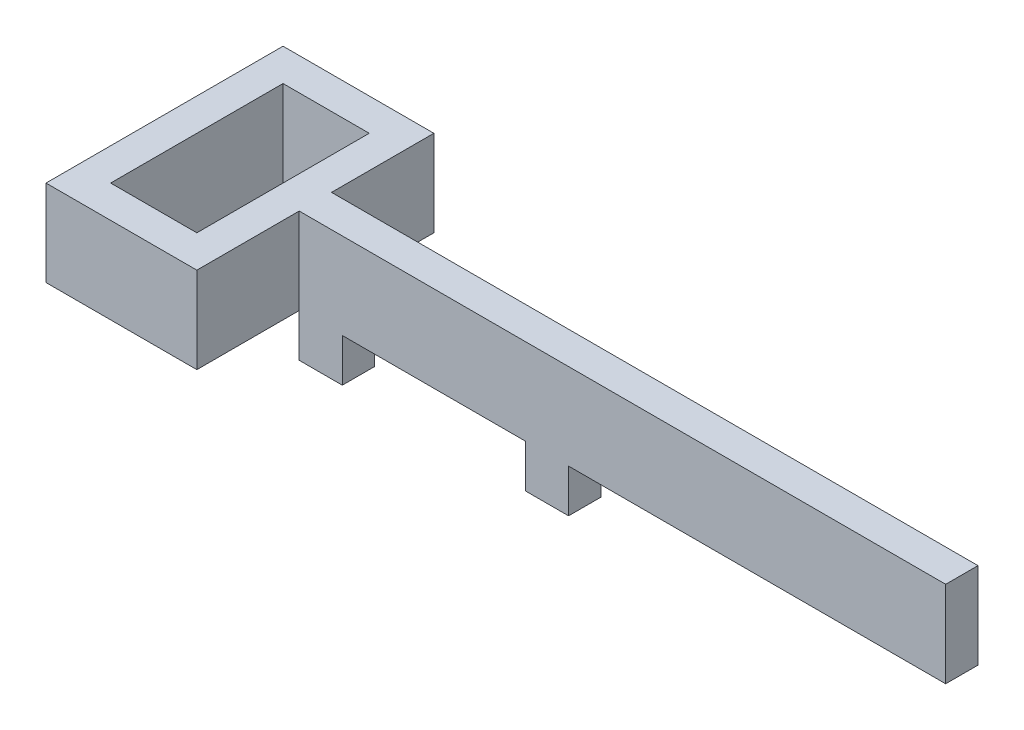
ISO-10303-21;
HEADER;
FILE_DESCRIPTION(('STEP AP214'),'2;1');
FILE_NAME('part.step','',(''),(''),'','','');
FILE_SCHEMA(('AUTOMOTIVE_DESIGN { 1 0 10303 214 1 1 1 1 }'));
ENDSEC;
DATA;
#1=APPLICATION_CONTEXT('core data for automotive mechanical design processes');
#2=APPLICATION_PROTOCOL_DEFINITION('international standard','automotive_design',2000,#1);
#3=PRODUCT_CONTEXT('',#1,'mechanical');
#4=PRODUCT('Part','Part','',(#3));
#5=PRODUCT_RELATED_PRODUCT_CATEGORY('part','',(#4));
#6=PRODUCT_DEFINITION_FORMATION('','',#4);
#7=PRODUCT_DEFINITION_CONTEXT('part definition',#1,'design');
#8=PRODUCT_DEFINITION('design','',#6,#7);
#9=PRODUCT_DEFINITION_SHAPE('','',#8);
#10=(LENGTH_UNIT() NAMED_UNIT(*) SI_UNIT(.MILLI.,.METRE.));
#11=(NAMED_UNIT(*) PLANE_ANGLE_UNIT() SI_UNIT($,.RADIAN.));
#12=(NAMED_UNIT(*) SI_UNIT($,.STERADIAN.) SOLID_ANGLE_UNIT());
#13=UNCERTAINTY_MEASURE_WITH_UNIT(LENGTH_MEASURE(1.E-05),#10,'distance_accuracy_value','');
#14=(GEOMETRIC_REPRESENTATION_CONTEXT(3) GLOBAL_UNCERTAINTY_ASSIGNED_CONTEXT((#13)) GLOBAL_UNIT_ASSIGNED_CONTEXT((#10,
#11,#12)) REPRESENTATION_CONTEXT('',''));
#15=CARTESIAN_POINT('',(0.,0.,0.));
#16=DIRECTION('',(0.,0.,1.));
#17=DIRECTION('',(1.,0.,0.));
#18=AXIS2_PLACEMENT_3D('',#15,#16,#17);
#19=CARTESIAN_POINT('',(0.,0.,0.));
#20=DIRECTION('',(0.,1.,0.));
#21=DIRECTION('',(0.,0.,1.));
#22=AXIS2_PLACEMENT_3D('',#19,#20,#21);
#23=PLANE('',#22);
#24=DIRECTION('',(0.,0.,-1.));
#25=VECTOR('',#24,1.);
#26=CARTESIAN_POINT('',(2.,0.,0.));
#27=LINE('',#26,#25);
#28=CARTESIAN_POINT('',(2.,0.,4.));
#29=VERTEX_POINT('',#28);
#30=CARTESIAN_POINT('',(2.,0.,-4.));
#31=VERTEX_POINT('',#30);
#32=EDGE_CURVE('E317',#29,#31,#27,.T.);
#33=ORIENTED_EDGE('',*,*,#32,.T.);
#34=DIRECTION('',(1.,0.,0.));
#35=VECTOR('',#34,1.);
#36=CARTESIAN_POINT('',(0.,0.,-4.));
#37=LINE('',#36,#35);
#38=CARTESIAN_POINT('',(-2.,0.,-4.));
#39=VERTEX_POINT('',#38);
#40=EDGE_CURVE('E253',#39,#31,#37,.T.);
#41=ORIENTED_EDGE('',*,*,#40,.F.);
#42=DIRECTION('',(0.,0.,-1.));
#43=VECTOR('',#42,1.);
#44=CARTESIAN_POINT('',(-2.,0.,0.));
#45=LINE('',#44,#43);
#46=CARTESIAN_POINT('',(-2.,0.,4.));
#47=VERTEX_POINT('',#46);
#48=EDGE_CURVE('E326',#47,#39,#45,.T.);
#49=ORIENTED_EDGE('',*,*,#48,.F.);
#50=DIRECTION('',(1.,0.,0.));
#51=VECTOR('',#50,1.);
#52=CARTESIAN_POINT('',(0.,0.,4.));
#53=LINE('',#52,#51);
#54=EDGE_CURVE('E322',#47,#29,#53,.T.);
#55=ORIENTED_EDGE('',*,*,#54,.T.);
#56=EDGE_LOOP('',(#33,#41,#49,#55));
#57=FACE_BOUND('',#56,.T.);
#58=DIRECTION('',(0.,0.,-1.));
#59=VECTOR('',#58,1.);
#60=CARTESIAN_POINT('',(3.5,0.,0.75));
#61=LINE('',#60,#59);
#62=CARTESIAN_POINT('',(3.5,0.,0.75));
#63=VERTEX_POINT('',#62);
#64=CARTESIAN_POINT('',(3.5,0.,-0.75));
#65=VERTEX_POINT('',#64);
#66=EDGE_CURVE('E204',#63,#65,#61,.T.);
#67=ORIENTED_EDGE('',*,*,#66,.F.);
#68=DIRECTION('',(0.,0.,-1.));
#69=VECTOR('',#68,1.);
#70=CARTESIAN_POINT('',(3.5,0.,0.));
#71=LINE('',#70,#69);
#72=CARTESIAN_POINT('',(3.5,0.,5.5));
#73=VERTEX_POINT('',#72);
#74=EDGE_CURVE('E303',#73,#63,#71,.T.);
#75=ORIENTED_EDGE('',*,*,#74,.F.);
#76=DIRECTION('',(1.,0.,0.));
#77=VECTOR('',#76,1.);
#78=CARTESIAN_POINT('',(0.,0.,5.5));
#79=LINE('',#78,#77);
#80=CARTESIAN_POINT('',(-3.5,0.,5.5));
#81=VERTEX_POINT('',#80);
#82=EDGE_CURVE('E311',#81,#73,#79,.T.);
#83=ORIENTED_EDGE('',*,*,#82,.F.);
#84=DIRECTION('',(0.,0.,-1.));
#85=VECTOR('',#84,1.);
#86=CARTESIAN_POINT('',(-3.5,0.,0.));
#87=LINE('',#86,#85);
#88=CARTESIAN_POINT('',(-3.5,0.,-5.5));
#89=VERTEX_POINT('',#88);
#90=EDGE_CURVE('E307',#81,#89,#87,.T.);
#91=ORIENTED_EDGE('',*,*,#90,.T.);
#92=DIRECTION('',(1.,0.,0.));
#93=VECTOR('',#92,1.);
#94=CARTESIAN_POINT('',(0.,0.,-5.5));
#95=LINE('',#94,#93);
#96=CARTESIAN_POINT('',(3.5,0.,-5.5));
#97=VERTEX_POINT('',#96);
#98=EDGE_CURVE('E302',#89,#97,#95,.T.);
#99=ORIENTED_EDGE('',*,*,#98,.T.);
#100=EDGE_CURVE('E298',#65,#97,#71,.T.);
#101=ORIENTED_EDGE('',*,*,#100,.F.);
#102=EDGE_LOOP('',(#67,#75,#83,#91,#99,#101));
#103=FACE_BOUND('',#102,.T.);
#104=ADVANCED_FACE('F47',(#57,#103),#23,.F.);
#105=DIRECTION('',(0.,0.,1.));
#106=VECTOR('',#105,1.);
#107=CARTESIAN_POINT('',(5.5,0.,0.75));
#108=LINE('',#107,#106);
#109=CARTESIAN_POINT('',(5.5,0.,-0.75));
#110=VERTEX_POINT('',#109);
#111=CARTESIAN_POINT('',(5.5,0.,0.749999999999999));
#112=VERTEX_POINT('',#111);
#113=EDGE_CURVE('E200',#110,#112,#108,.T.);
#114=ORIENTED_EDGE('',*,*,#113,.F.);
#115=DIRECTION('',(1.,0.,0.));
#116=VECTOR('',#115,1.);
#117=CARTESIAN_POINT('',(0.,0.,-0.75));
#118=LINE('',#117,#116);
#119=CARTESIAN_POINT('',(14.,0.,-0.75));
#120=VERTEX_POINT('',#119);
#121=EDGE_CURVE('E295',#110,#120,#118,.T.);
#122=ORIENTED_EDGE('',*,*,#121,.T.);
#123=DIRECTION('',(0.,0.,-1.));
#124=VECTOR('',#123,1.);
#125=CARTESIAN_POINT('',(14.,0.,0.75));
#126=LINE('',#125,#124);
#127=CARTESIAN_POINT('',(14.,0.,0.749999999999994));
#128=VERTEX_POINT('',#127);
#129=EDGE_CURVE('E207',#128,#120,#126,.T.);
#130=ORIENTED_EDGE('',*,*,#129,.F.);
#131=DIRECTION('',(1.,0.,0.));
#132=VECTOR('',#131,1.);
#133=CARTESIAN_POINT('',(0.,0.,0.750000000000002));
#134=LINE('',#133,#132);
#135=EDGE_CURVE('E314',#112,#128,#134,.T.);
#136=ORIENTED_EDGE('',*,*,#135,.F.);
#137=EDGE_LOOP('',(#114,#122,#130,#136));
#138=FACE_BOUND('',#137,.T.);
#139=ADVANCED_FACE('F424',(#138),#23,.F.);
#140=DIRECTION('',(0.,0.,1.));
#141=VECTOR('',#140,1.);
#142=CARTESIAN_POINT('',(16.,0.,0.75));
#143=LINE('',#142,#141);
#144=CARTESIAN_POINT('',(16.,0.,-0.75));
#145=VERTEX_POINT('',#144);
#146=CARTESIAN_POINT('',(16.,0.,0.75));
#147=VERTEX_POINT('',#146);
#148=EDGE_CURVE('E73',#145,#147,#143,.T.);
#149=ORIENTED_EDGE('',*,*,#148,.F.);
#150=CARTESIAN_POINT('',(33.5,0.,-0.75));
#151=VERTEX_POINT('',#150);
#152=EDGE_CURVE('E294',#145,#151,#118,.T.);
#153=ORIENTED_EDGE('',*,*,#152,.T.);
#154=DIRECTION('',(0.,0.,1.));
#155=VECTOR('',#154,1.);
#156=CARTESIAN_POINT('',(33.5,0.,0.));
#157=LINE('',#156,#155);
#158=CARTESIAN_POINT('',(33.5,0.,0.749999999999982));
#159=VERTEX_POINT('',#158);
#160=EDGE_CURVE('E247',#151,#159,#157,.T.);
#161=ORIENTED_EDGE('',*,*,#160,.T.);
#162=EDGE_CURVE('E318',#147,#159,#134,.T.);
#163=ORIENTED_EDGE('',*,*,#162,.F.);
#164=EDGE_LOOP('',(#149,#153,#161,#163));
#165=FACE_BOUND('',#164,.T.);
#166=ADVANCED_FACE('F374',(#165),#23,.F.);
#167=CARTESIAN_POINT('',(2.,4.,0.));
#168=DIRECTION('',(-1.,0.,0.));
#169=DIRECTION('',(0.,0.,1.));
#170=AXIS2_PLACEMENT_3D('',#167,#168,#169);
#171=PLANE('',#170);
#172=ORIENTED_EDGE('',*,*,#32,.F.);
#173=DIRECTION('',(0.,-1.,0.));
#174=VECTOR('',#173,1.);
#175=CARTESIAN_POINT('',(2.,4.,4.));
#176=LINE('',#175,#174);
#177=CARTESIAN_POINT('',(2.,4.,4.));
#178=VERTEX_POINT('',#177);
#179=EDGE_CURVE('E11',#178,#29,#176,.T.);
#180=ORIENTED_EDGE('',*,*,#179,.F.);
#181=DIRECTION('',(0.,0.,-1.));
#182=VECTOR('',#181,1.);
#183=CARTESIAN_POINT('',(2.,4.,0.));
#184=LINE('',#183,#182);
#185=CARTESIAN_POINT('',(2.,4.,-4.));
#186=VERTEX_POINT('',#185);
#187=EDGE_CURVE('E275',#178,#186,#184,.T.);
#188=ORIENTED_EDGE('',*,*,#187,.T.);
#189=DIRECTION('',(0.,-1.,0.));
#190=VECTOR('',#189,1.);
#191=CARTESIAN_POINT('',(2.,4.,-4.));
#192=LINE('',#191,#190);
#193=EDGE_CURVE('E333',#186,#31,#192,.T.);
#194=ORIENTED_EDGE('',*,*,#193,.T.);
#195=EDGE_LOOP('',(#172,#180,#188,#194));
#196=FACE_BOUND('',#195,.T.);
#197=ADVANCED_FACE('F454',(#196),#171,.T.);
#198=CARTESIAN_POINT('',(0.,4.,4.));
#199=DIRECTION('',(0.,0.,-1.));
#200=DIRECTION('',(-1.,0.,0.));
#201=AXIS2_PLACEMENT_3D('',#198,#199,#200);
#202=PLANE('',#201);
#203=ORIENTED_EDGE('',*,*,#54,.F.);
#204=DIRECTION('',(0.,-1.,0.));
#205=VECTOR('',#204,1.);
#206=CARTESIAN_POINT('',(-2.,4.,4.));
#207=LINE('',#206,#205);
#208=CARTESIAN_POINT('',(-2.,4.,4.));
#209=VERTEX_POINT('',#208);
#210=EDGE_CURVE('E57',#209,#47,#207,.T.);
#211=ORIENTED_EDGE('',*,*,#210,.F.);
#212=DIRECTION('',(1.,0.,0.));
#213=VECTOR('',#212,1.);
#214=CARTESIAN_POINT('',(0.,4.,4.));
#215=LINE('',#214,#213);
#216=EDGE_CURVE('E279',#209,#178,#215,.T.);
#217=ORIENTED_EDGE('',*,*,#216,.T.);
#218=ORIENTED_EDGE('',*,*,#179,.T.);
#219=EDGE_LOOP('',(#203,#211,#217,#218));
#220=FACE_BOUND('',#219,.T.);
#221=ADVANCED_FACE('F459',(#220),#202,.T.);
#222=CARTESIAN_POINT('',(-2.,4.,0.));
#223=DIRECTION('',(-1.,0.,0.));
#224=DIRECTION('',(0.,0.,1.));
#225=AXIS2_PLACEMENT_3D('',#222,#223,#224);
#226=PLANE('',#225);
#227=ORIENTED_EDGE('',*,*,#48,.T.);
#228=DIRECTION('',(0.,-1.,0.));
#229=VECTOR('',#228,1.);
#230=CARTESIAN_POINT('',(-2.,4.,-4.));
#231=LINE('',#230,#229);
#232=CARTESIAN_POINT('',(-2.,4.,-4.));
#233=VERTEX_POINT('',#232);
#234=EDGE_CURVE('E336',#233,#39,#231,.T.);
#235=ORIENTED_EDGE('',*,*,#234,.F.);
#236=DIRECTION('',(0.,0.,-1.));
#237=VECTOR('',#236,1.);
#238=CARTESIAN_POINT('',(-2.,4.,0.));
#239=LINE('',#238,#237);
#240=EDGE_CURVE('E283',#209,#233,#239,.T.);
#241=ORIENTED_EDGE('',*,*,#240,.F.);
#242=ORIENTED_EDGE('',*,*,#210,.T.);
#243=EDGE_LOOP('',(#227,#235,#241,#242));
#244=FACE_BOUND('',#243,.T.);
#245=ADVANCED_FACE('F465',(#244),#226,.F.);
#246=CARTESIAN_POINT('',(33.5,4.,0.));
#247=DIRECTION('',(1.,0.,0.));
#248=DIRECTION('',(0.,0.,-1.));
#249=AXIS2_PLACEMENT_3D('',#246,#247,#248);
#250=PLANE('',#249);
#251=ORIENTED_EDGE('',*,*,#160,.F.);
#252=DIRECTION('',(0.,-1.,0.));
#253=VECTOR('',#252,1.);
#254=CARTESIAN_POINT('',(33.5,4.,-0.75));
#255=LINE('',#254,#253);
#256=CARTESIAN_POINT('',(33.5,4.,-0.75));
#257=VERTEX_POINT('',#256);
#258=EDGE_CURVE('E51',#257,#151,#255,.T.);
#259=ORIENTED_EDGE('',*,*,#258,.F.);
#260=DIRECTION('',(0.,0.,1.));
#261=VECTOR('',#260,1.);
#262=CARTESIAN_POINT('',(33.5,4.,0.));
#263=LINE('',#262,#261);
#264=CARTESIAN_POINT('',(33.5,4.,0.749999999999982));
#265=VERTEX_POINT('',#264);
#266=EDGE_CURVE('E248',#257,#265,#263,.T.);
#267=ORIENTED_EDGE('',*,*,#266,.T.);
#268=DIRECTION('',(0.,-1.,0.));
#269=VECTOR('',#268,1.);
#270=CARTESIAN_POINT('',(33.5,4.,0.749999999999982));
#271=LINE('',#270,#269);
#272=EDGE_CURVE('E290',#265,#159,#271,.T.);
#273=ORIENTED_EDGE('',*,*,#272,.T.);
#274=EDGE_LOOP('',(#251,#259,#267,#273));
#275=FACE_BOUND('',#274,.T.);
#276=ADVANCED_FACE('F49',(#275),#250,.T.);
#277=CARTESIAN_POINT('',(0.,4.,-0.75));
#278=DIRECTION('',(0.,0.,-1.));
#279=DIRECTION('',(-1.,0.,0.));
#280=AXIS2_PLACEMENT_3D('',#277,#278,#279);
#281=PLANE('',#280);
#282=ORIENTED_EDGE('',*,*,#121,.F.);
#283=DIRECTION('',(0.,1.,0.));
#284=VECTOR('',#283,1.);
#285=CARTESIAN_POINT('',(5.5,-2.,-0.75));
#286=LINE('',#285,#284);
#287=CARTESIAN_POINT('',(5.5,-2.,-0.75));
#288=VERTEX_POINT('',#287);
#289=EDGE_CURVE('E187',#288,#110,#286,.T.);
#290=ORIENTED_EDGE('',*,*,#289,.F.);
#291=DIRECTION('',(1.,0.,0.));
#292=VECTOR('',#291,1.);
#293=CARTESIAN_POINT('',(3.5,-2.,-0.75));
#294=LINE('',#293,#292);
#295=CARTESIAN_POINT('',(3.5,-2.,-0.75));
#296=VERTEX_POINT('',#295);
#297=EDGE_CURVE('E180',#296,#288,#294,.T.);
#298=ORIENTED_EDGE('',*,*,#297,.F.);
#299=DIRECTION('',(0.,1.,0.));
#300=VECTOR('',#299,1.);
#301=CARTESIAN_POINT('',(3.5,-2.,-0.75));
#302=LINE('',#301,#300);
#303=EDGE_CURVE('E185',#296,#65,#302,.T.);
#304=ORIENTED_EDGE('',*,*,#303,.T.);
#305=DIRECTION('',(0.,-1.,0.));
#306=VECTOR('',#305,1.);
#307=CARTESIAN_POINT('',(3.5,4.,-0.75));
#308=LINE('',#307,#306);
#309=CARTESIAN_POINT('',(3.5,4.,-0.75));
#310=VERTEX_POINT('',#309);
#311=EDGE_CURVE('E361',#310,#65,#308,.T.);
#312=ORIENTED_EDGE('',*,*,#311,.F.);
#313=DIRECTION('',(1.,0.,0.));
#314=VECTOR('',#313,1.);
#315=CARTESIAN_POINT('',(0.,4.,-0.75));
#316=LINE('',#315,#314);
#317=EDGE_CURVE('E252',#310,#257,#316,.T.);
#318=ORIENTED_EDGE('',*,*,#317,.T.);
#319=ORIENTED_EDGE('',*,*,#258,.T.);
#320=ORIENTED_EDGE('',*,*,#152,.F.);
#321=DIRECTION('',(0.,1.,0.));
#322=VECTOR('',#321,1.);
#323=CARTESIAN_POINT('',(16.,-2.,-0.75));
#324=LINE('',#323,#322);
#325=CARTESIAN_POINT('',(16.,-2.,-0.75));
#326=VERTEX_POINT('',#325);
#327=EDGE_CURVE('E239',#326,#145,#324,.T.);
#328=ORIENTED_EDGE('',*,*,#327,.F.);
#329=DIRECTION('',(1.,0.,0.));
#330=VECTOR('',#329,1.);
#331=CARTESIAN_POINT('',(14.,-2.,-0.75));
#332=LINE('',#331,#330);
#333=CARTESIAN_POINT('',(14.,-2.,-0.75));
#334=VERTEX_POINT('',#333);
#335=EDGE_CURVE('E220',#334,#326,#332,.T.);
#336=ORIENTED_EDGE('',*,*,#335,.F.);
#337=DIRECTION('',(0.,1.,0.));
#338=VECTOR('',#337,1.);
#339=CARTESIAN_POINT('',(14.,-2.,-0.75));
#340=LINE('',#339,#338);
#341=EDGE_CURVE('E243',#334,#120,#340,.T.);
#342=ORIENTED_EDGE('',*,*,#341,.T.);
#343=EDGE_LOOP('',(#282,#290,#298,#304,#312,#318,#319,#320,#328,#336,#342));
#344=FACE_BOUND('',#343,.T.);
#345=ADVANCED_FACE('F183',(#344),#281,.T.);
#346=CARTESIAN_POINT('',(3.5,4.,0.));
#347=DIRECTION('',(-1.,0.,0.));
#348=DIRECTION('',(0.,0.,1.));
#349=AXIS2_PLACEMENT_3D('',#346,#347,#348);
#350=PLANE('',#349);
#351=ORIENTED_EDGE('',*,*,#100,.T.);
#352=DIRECTION('',(0.,-1.,0.));
#353=VECTOR('',#352,1.);
#354=CARTESIAN_POINT('',(3.5,4.,-5.5));
#355=LINE('',#354,#353);
#356=CARTESIAN_POINT('',(3.5,4.,-5.5));
#357=VERTEX_POINT('',#356);
#358=EDGE_CURVE('E359',#357,#97,#355,.T.);
#359=ORIENTED_EDGE('',*,*,#358,.F.);
#360=DIRECTION('',(0.,0.,-1.));
#361=VECTOR('',#360,1.);
#362=CARTESIAN_POINT('',(3.5,4.,0.));
#363=LINE('',#362,#361);
#364=EDGE_CURVE('E257',#310,#357,#363,.T.);
#365=ORIENTED_EDGE('',*,*,#364,.F.);
#366=ORIENTED_EDGE('',*,*,#311,.T.);
#367=EDGE_LOOP('',(#351,#359,#365,#366));
#368=FACE_BOUND('',#367,.T.);
#369=ADVANCED_FACE('F395',(#368),#350,.F.);
#370=CARTESIAN_POINT('',(0.,4.,-5.5));
#371=DIRECTION('',(0.,0.,-1.));
#372=DIRECTION('',(-1.,0.,0.));
#373=AXIS2_PLACEMENT_3D('',#370,#371,#372);
#374=PLANE('',#373);
#375=ORIENTED_EDGE('',*,*,#98,.F.);
#376=DIRECTION('',(0.,-1.,0.));
#377=VECTOR('',#376,1.);
#378=CARTESIAN_POINT('',(-3.5,4.,-5.5));
#379=LINE('',#378,#377);
#380=CARTESIAN_POINT('',(-3.5,4.,-5.5));
#381=VERTEX_POINT('',#380);
#382=EDGE_CURVE('E356',#381,#89,#379,.T.);
#383=ORIENTED_EDGE('',*,*,#382,.F.);
#384=DIRECTION('',(1.,0.,0.));
#385=VECTOR('',#384,1.);
#386=CARTESIAN_POINT('',(0.,4.,-5.5));
#387=LINE('',#386,#385);
#388=EDGE_CURVE('E260',#381,#357,#387,.T.);
#389=ORIENTED_EDGE('',*,*,#388,.T.);
#390=ORIENTED_EDGE('',*,*,#358,.T.);
#391=EDGE_LOOP('',(#375,#383,#389,#390));
#392=FACE_BOUND('',#391,.T.);
#393=ADVANCED_FACE('F398',(#392),#374,.T.);
#394=CARTESIAN_POINT('',(-3.5,4.,0.));
#395=DIRECTION('',(-1.,0.,0.));
#396=DIRECTION('',(0.,0.,1.));
#397=AXIS2_PLACEMENT_3D('',#394,#395,#396);
#398=PLANE('',#397);
#399=ORIENTED_EDGE('',*,*,#90,.F.);
#400=DIRECTION('',(0.,-1.,0.));
#401=VECTOR('',#400,1.);
#402=CARTESIAN_POINT('',(-3.5,4.,5.5));
#403=LINE('',#402,#401);
#404=CARTESIAN_POINT('',(-3.5,4.,5.5));
#405=VERTEX_POINT('',#404);
#406=EDGE_CURVE('E353',#405,#81,#403,.T.);
#407=ORIENTED_EDGE('',*,*,#406,.F.);
#408=DIRECTION('',(0.,0.,-1.));
#409=VECTOR('',#408,1.);
#410=CARTESIAN_POINT('',(-3.5,4.,0.));
#411=LINE('',#410,#409);
#412=EDGE_CURVE('E265',#405,#381,#411,.T.);
#413=ORIENTED_EDGE('',*,*,#412,.T.);
#414=ORIENTED_EDGE('',*,*,#382,.T.);
#415=EDGE_LOOP('',(#399,#407,#413,#414));
#416=FACE_BOUND('',#415,.T.);
#417=ADVANCED_FACE('F401',(#416),#398,.T.);
#418=CARTESIAN_POINT('',(0.,4.,5.5));
#419=DIRECTION('',(0.,0.,-1.));
#420=DIRECTION('',(-1.,0.,0.));
#421=AXIS2_PLACEMENT_3D('',#418,#419,#420);
#422=PLANE('',#421);
#423=ORIENTED_EDGE('',*,*,#82,.T.);
#424=DIRECTION('',(0.,-1.,0.));
#425=VECTOR('',#424,1.);
#426=CARTESIAN_POINT('',(3.5,4.,5.5));
#427=LINE('',#426,#425);
#428=CARTESIAN_POINT('',(3.5,4.,5.5));
#429=VERTEX_POINT('',#428);
#430=EDGE_CURVE('E349',#429,#73,#427,.T.);
#431=ORIENTED_EDGE('',*,*,#430,.F.);
#432=DIRECTION('',(1.,0.,0.));
#433=VECTOR('',#432,1.);
#434=CARTESIAN_POINT('',(0.,4.,5.5));
#435=LINE('',#434,#433);
#436=EDGE_CURVE('E269',#405,#429,#435,.T.);
#437=ORIENTED_EDGE('',*,*,#436,.F.);
#438=ORIENTED_EDGE('',*,*,#406,.T.);
#439=EDGE_LOOP('',(#423,#431,#437,#438));
#440=FACE_BOUND('',#439,.T.);
#441=ADVANCED_FACE('F404',(#440),#422,.F.);
#442=ORIENTED_EDGE('',*,*,#74,.T.);
#443=DIRECTION('',(0.,-1.,0.));
#444=VECTOR('',#443,1.);
#445=CARTESIAN_POINT('',(3.5,4.,0.75));
#446=LINE('',#445,#444);
#447=CARTESIAN_POINT('',(3.5,4.,0.75));
#448=VERTEX_POINT('',#447);
#449=EDGE_CURVE('E345',#448,#63,#446,.T.);
#450=ORIENTED_EDGE('',*,*,#449,.F.);
#451=EDGE_CURVE('E261',#429,#448,#363,.T.);
#452=ORIENTED_EDGE('',*,*,#451,.F.);
#453=ORIENTED_EDGE('',*,*,#430,.T.);
#454=EDGE_LOOP('',(#442,#450,#452,#453));
#455=FACE_BOUND('',#454,.T.);
#456=ADVANCED_FACE('F390',(#455),#350,.F.);
#457=CARTESIAN_POINT('',(0.,4.,0.750000000000002));
#458=DIRECTION('',(0.,0.,-1.));
#459=DIRECTION('',(-1.,0.,0.));
#460=AXIS2_PLACEMENT_3D('',#457,#458,#459);
#461=PLANE('',#460);
#462=ORIENTED_EDGE('',*,*,#449,.T.);
#463=DIRECTION('',(0.,1.,0.));
#464=VECTOR('',#463,1.);
#465=CARTESIAN_POINT('',(3.5,-2.,0.75));
#466=LINE('',#465,#464);
#467=CARTESIAN_POINT('',(3.5,-2.,0.75));
#468=VERTEX_POINT('',#467);
#469=EDGE_CURVE('E413',#468,#63,#466,.T.);
#470=ORIENTED_EDGE('',*,*,#469,.F.);
#471=DIRECTION('',(-1.,0.,0.));
#472=VECTOR('',#471,1.);
#473=CARTESIAN_POINT('',(3.5,-2.,0.75));
#474=LINE('',#473,#472);
#475=CARTESIAN_POINT('',(5.5,-2.,0.75));
#476=VERTEX_POINT('',#475);
#477=EDGE_CURVE('E196',#476,#468,#474,.T.);
#478=ORIENTED_EDGE('',*,*,#477,.F.);
#479=DIRECTION('',(0.,1.,0.));
#480=VECTOR('',#479,1.);
#481=CARTESIAN_POINT('',(5.5,-2.,0.75));
#482=LINE('',#481,#480);
#483=EDGE_CURVE('E65',#476,#112,#482,.T.);
#484=ORIENTED_EDGE('',*,*,#483,.T.);
#485=ORIENTED_EDGE('',*,*,#135,.T.);
#486=DIRECTION('',(0.,1.,0.));
#487=VECTOR('',#486,1.);
#488=CARTESIAN_POINT('',(14.,-2.,0.75));
#489=LINE('',#488,#487);
#490=CARTESIAN_POINT('',(14.,-2.,0.75));
#491=VERTEX_POINT('',#490);
#492=EDGE_CURVE('E228',#491,#128,#489,.T.);
#493=ORIENTED_EDGE('',*,*,#492,.F.);
#494=DIRECTION('',(-1.,0.,0.));
#495=VECTOR('',#494,1.);
#496=CARTESIAN_POINT('',(14.,-2.,0.75));
#497=LINE('',#496,#495);
#498=CARTESIAN_POINT('',(16.,-2.,0.75));
#499=VERTEX_POINT('',#498);
#500=EDGE_CURVE('E226',#499,#491,#497,.T.);
#501=ORIENTED_EDGE('',*,*,#500,.F.);
#502=DIRECTION('',(0.,1.,0.));
#503=VECTOR('',#502,1.);
#504=CARTESIAN_POINT('',(16.,-2.,0.75));
#505=LINE('',#504,#503);
#506=EDGE_CURVE('E235',#499,#147,#505,.T.);
#507=ORIENTED_EDGE('',*,*,#506,.T.);
#508=ORIENTED_EDGE('',*,*,#162,.T.);
#509=ORIENTED_EDGE('',*,*,#272,.F.);
#510=DIRECTION('',(1.,0.,0.));
#511=VECTOR('',#510,1.);
#512=CARTESIAN_POINT('',(0.,4.,0.750000000000002));
#513=LINE('',#512,#511);
#514=EDGE_CURVE('E272',#448,#265,#513,.T.);
#515=ORIENTED_EDGE('',*,*,#514,.F.);
#516=EDGE_LOOP('',(#462,#470,#478,#484,#485,#493,#501,#507,#508,#509,#515));
#517=FACE_BOUND('',#516,.T.);
#518=ADVANCED_FACE('F392',(#517),#461,.F.);
#519=CARTESIAN_POINT('',(0.,4.,-4.));
#520=DIRECTION('',(0.,0.,-1.));
#521=DIRECTION('',(-1.,0.,0.));
#522=AXIS2_PLACEMENT_3D('',#519,#520,#521);
#523=PLANE('',#522);
#524=ORIENTED_EDGE('',*,*,#40,.T.);
#525=ORIENTED_EDGE('',*,*,#193,.F.);
#526=DIRECTION('',(1.,0.,0.));
#527=VECTOR('',#526,1.);
#528=CARTESIAN_POINT('',(0.,4.,-4.));
#529=LINE('',#528,#527);
#530=EDGE_CURVE('E287',#233,#186,#529,.T.);
#531=ORIENTED_EDGE('',*,*,#530,.F.);
#532=ORIENTED_EDGE('',*,*,#234,.T.);
#533=EDGE_LOOP('',(#524,#525,#531,#532));
#534=FACE_BOUND('',#533,.T.);
#535=ADVANCED_FACE('F473',(#534),#523,.F.);
#536=CARTESIAN_POINT('',(0.,4.,0.));
#537=DIRECTION('',(0.,1.,0.));
#538=DIRECTION('',(0.,0.,1.));
#539=AXIS2_PLACEMENT_3D('',#536,#537,#538);
#540=PLANE('',#539);
#541=ORIENTED_EDGE('',*,*,#266,.F.);
#542=ORIENTED_EDGE('',*,*,#317,.F.);
#543=ORIENTED_EDGE('',*,*,#364,.T.);
#544=ORIENTED_EDGE('',*,*,#388,.F.);
#545=ORIENTED_EDGE('',*,*,#412,.F.);
#546=ORIENTED_EDGE('',*,*,#436,.T.);
#547=ORIENTED_EDGE('',*,*,#451,.T.);
#548=ORIENTED_EDGE('',*,*,#514,.T.);
#549=EDGE_LOOP('',(#541,#542,#543,#544,#545,#546,#547,#548));
#550=FACE_BOUND('',#549,.T.);
#551=ORIENTED_EDGE('',*,*,#187,.F.);
#552=ORIENTED_EDGE('',*,*,#216,.F.);
#553=ORIENTED_EDGE('',*,*,#240,.T.);
#554=ORIENTED_EDGE('',*,*,#530,.T.);
#555=EDGE_LOOP('',(#551,#552,#553,#554));
#556=FACE_BOUND('',#555,.T.);
#557=ADVANCED_FACE('F383',(#550,#556),#540,.T.);
#558=CARTESIAN_POINT('',(14.,-2.,0.75));
#559=DIRECTION('',(1.,0.,0.));
#560=DIRECTION('',(0.,0.,-1.));
#561=AXIS2_PLACEMENT_3D('',#558,#559,#560);
#562=PLANE('',#561);
#563=ORIENTED_EDGE('',*,*,#129,.T.);
#564=ORIENTED_EDGE('',*,*,#341,.F.);
#565=DIRECTION('',(0.,0.,-1.));
#566=VECTOR('',#565,1.);
#567=CARTESIAN_POINT('',(14.,-2.,0.75));
#568=LINE('',#567,#566);
#569=EDGE_CURVE('E216',#491,#334,#568,.T.);
#570=ORIENTED_EDGE('',*,*,#569,.F.);
#571=ORIENTED_EDGE('',*,*,#492,.T.);
#572=EDGE_LOOP('',(#563,#564,#570,#571));
#573=FACE_BOUND('',#572,.T.);
#574=ADVANCED_FACE('F430',(#573),#562,.F.);
#575=CARTESIAN_POINT('',(16.,-2.,0.75));
#576=DIRECTION('',(-1.,0.,0.));
#577=DIRECTION('',(0.,0.,1.));
#578=AXIS2_PLACEMENT_3D('',#575,#576,#577);
#579=PLANE('',#578);
#580=ORIENTED_EDGE('',*,*,#148,.T.);
#581=ORIENTED_EDGE('',*,*,#506,.F.);
#582=DIRECTION('',(0.,0.,1.));
#583=VECTOR('',#582,1.);
#584=CARTESIAN_POINT('',(16.,-2.,0.75));
#585=LINE('',#584,#583);
#586=EDGE_CURVE('E223',#326,#499,#585,.T.);
#587=ORIENTED_EDGE('',*,*,#586,.F.);
#588=ORIENTED_EDGE('',*,*,#327,.T.);
#589=EDGE_LOOP('',(#580,#581,#587,#588));
#590=FACE_BOUND('',#589,.T.);
#591=ADVANCED_FACE('F436',(#590),#579,.F.);
#592=CARTESIAN_POINT('',(0.,-2.,0.));
#593=DIRECTION('',(0.,-1.,0.));
#594=DIRECTION('',(0.,0.,-1.));
#595=AXIS2_PLACEMENT_3D('',#592,#593,#594);
#596=PLANE('',#595);
#597=ORIENTED_EDGE('',*,*,#569,.T.);
#598=ORIENTED_EDGE('',*,*,#335,.T.);
#599=ORIENTED_EDGE('',*,*,#586,.T.);
#600=ORIENTED_EDGE('',*,*,#500,.T.);
#601=EDGE_LOOP('',(#597,#598,#599,#600));
#602=FACE_BOUND('',#601,.T.);
#603=ADVANCED_FACE('F432',(#602),#596,.T.);
#604=CARTESIAN_POINT('',(3.5,-2.,0.75));
#605=DIRECTION('',(1.,0.,0.));
#606=DIRECTION('',(0.,0.,-1.));
#607=AXIS2_PLACEMENT_3D('',#604,#605,#606);
#608=PLANE('',#607);
#609=ORIENTED_EDGE('',*,*,#66,.T.);
#610=ORIENTED_EDGE('',*,*,#303,.F.);
#611=DIRECTION('',(0.,0.,-1.));
#612=VECTOR('',#611,1.);
#613=CARTESIAN_POINT('',(3.5,-2.,0.75));
#614=LINE('',#613,#612);
#615=EDGE_CURVE('E192',#468,#296,#614,.T.);
#616=ORIENTED_EDGE('',*,*,#615,.F.);
#617=ORIENTED_EDGE('',*,*,#469,.T.);
#618=EDGE_LOOP('',(#609,#610,#616,#617));
#619=FACE_BOUND('',#618,.T.);
#620=ADVANCED_FACE('F202',(#619),#608,.F.);
#621=CARTESIAN_POINT('',(5.5,-2.,0.75));
#622=DIRECTION('',(-1.,0.,0.));
#623=DIRECTION('',(0.,0.,1.));
#624=AXIS2_PLACEMENT_3D('',#621,#622,#623);
#625=PLANE('',#624);
#626=ORIENTED_EDGE('',*,*,#113,.T.);
#627=ORIENTED_EDGE('',*,*,#483,.F.);
#628=DIRECTION('',(0.,0.,1.));
#629=VECTOR('',#628,1.);
#630=CARTESIAN_POINT('',(5.5,-2.,0.75));
#631=LINE('',#630,#629);
#632=EDGE_CURVE('E191',#288,#476,#631,.T.);
#633=ORIENTED_EDGE('',*,*,#632,.F.);
#634=ORIENTED_EDGE('',*,*,#289,.T.);
#635=EDGE_LOOP('',(#626,#627,#633,#634));
#636=FACE_BOUND('',#635,.T.);
#637=ADVANCED_FACE('F419',(#636),#625,.F.);
#638=CARTESIAN_POINT('',(0.,-2.,0.));
#639=DIRECTION('',(0.,-1.,0.));
#640=DIRECTION('',(0.,0.,-1.));
#641=AXIS2_PLACEMENT_3D('',#638,#639,#640);
#642=PLANE('',#641);
#643=ORIENTED_EDGE('',*,*,#615,.T.);
#644=ORIENTED_EDGE('',*,*,#297,.T.);
#645=ORIENTED_EDGE('',*,*,#632,.T.);
#646=ORIENTED_EDGE('',*,*,#477,.T.);
#647=EDGE_LOOP('',(#643,#644,#645,#646));
#648=FACE_BOUND('',#647,.T.);
#649=ADVANCED_FACE('F195',(#648),#642,.T.);
#650=CLOSED_SHELL('',(#104,#139,#166,#197,#221,#245,#276,#345,#369,#393,#417,#441,#456,#518,
#535,#557,#574,#591,#603,#620,#637,#649));
#651=MANIFOLD_SOLID_BREP('B2',#650);
#652=ADVANCED_BREP_SHAPE_REPRESENTATION('',(#18,#651),#14);
#653=SHAPE_DEFINITION_REPRESENTATION(#9,#652);
ENDSEC;
END-ISO-10303-21;
